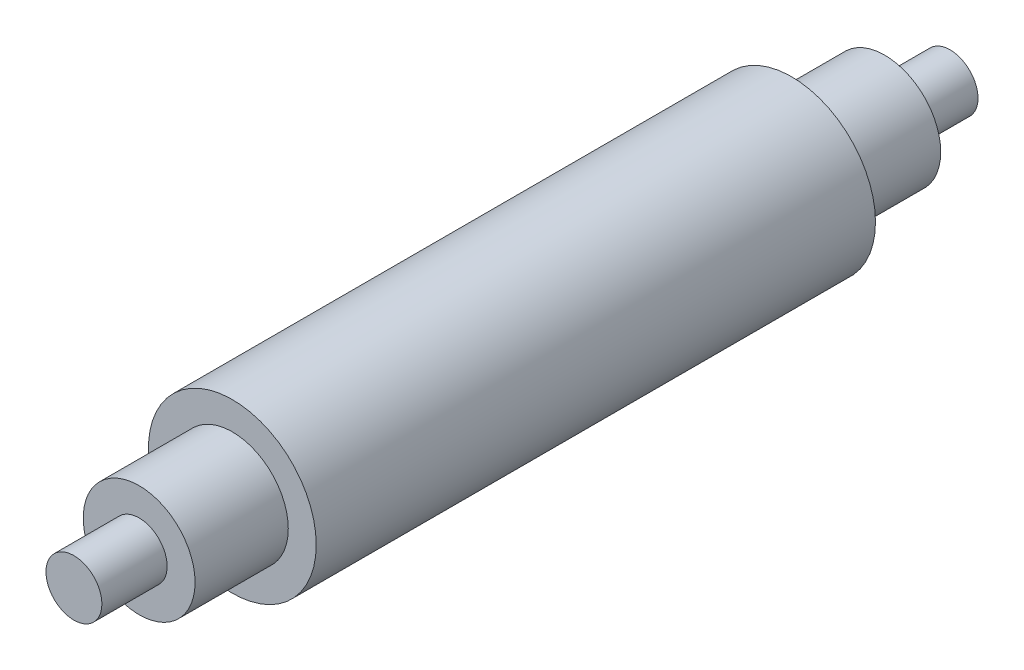
ISO-10303-21;
HEADER;
FILE_DESCRIPTION(('STEP AP214'),'2;1');
FILE_NAME('part.step','',(''),(''),'','','');
FILE_SCHEMA(('AUTOMOTIVE_DESIGN { 1 0 10303 214 1 1 1 1 }'));
ENDSEC;
DATA;
#1=APPLICATION_CONTEXT('core data for automotive mechanical design processes');
#2=APPLICATION_PROTOCOL_DEFINITION('international standard','automotive_design',2000,#1);
#3=PRODUCT_CONTEXT('',#1,'mechanical');
#4=PRODUCT('Part','Part','',(#3));
#5=PRODUCT_RELATED_PRODUCT_CATEGORY('part','',(#4));
#6=PRODUCT_DEFINITION_FORMATION('','',#4);
#7=PRODUCT_DEFINITION_CONTEXT('part definition',#1,'design');
#8=PRODUCT_DEFINITION('design','',#6,#7);
#9=PRODUCT_DEFINITION_SHAPE('','',#8);
#10=(LENGTH_UNIT() NAMED_UNIT(*) SI_UNIT(.MILLI.,.METRE.));
#11=(NAMED_UNIT(*) PLANE_ANGLE_UNIT() SI_UNIT($,.RADIAN.));
#12=(NAMED_UNIT(*) SI_UNIT($,.STERADIAN.) SOLID_ANGLE_UNIT());
#13=UNCERTAINTY_MEASURE_WITH_UNIT(LENGTH_MEASURE(1.E-05),#10,'distance_accuracy_value','');
#14=(GEOMETRIC_REPRESENTATION_CONTEXT(3) GLOBAL_UNCERTAINTY_ASSIGNED_CONTEXT((#13)) GLOBAL_UNIT_ASSIGNED_CONTEXT((#10,
#11,#12)) REPRESENTATION_CONTEXT('',''));
#15=CARTESIAN_POINT('',(0.,0.,0.));
#16=DIRECTION('',(0.,0.,1.));
#17=DIRECTION('',(1.,0.,0.));
#18=AXIS2_PLACEMENT_3D('',#15,#16,#17);
#19=CARTESIAN_POINT('',(0.,0.,-150.));
#20=DIRECTION('',(0.,0.,1.));
#21=DIRECTION('',(1.,0.,0.));
#22=AXIS2_PLACEMENT_3D('',#19,#20,#21);
#23=CYLINDRICAL_SURFACE('',#22,45.);
#24=CARTESIAN_POINT('',(0.,0.,-150.));
#25=DIRECTION('',(0.,0.,1.));
#26=DIRECTION('',(1.,0.,0.));
#27=AXIS2_PLACEMENT_3D('',#24,#25,#26);
#28=CIRCLE('',#27,45.);
#29=CARTESIAN_POINT('',(45.,0.,-150.));
#30=VERTEX_POINT('',#29);
#31=EDGE_CURVE('E55',#30,#30,#28,.T.);
#32=ORIENTED_EDGE('',*,*,#31,.T.);
#33=EDGE_LOOP('',(#32));
#34=FACE_BOUND('',#33,.T.);
#35=CARTESIAN_POINT('',(0.,0.,150.));
#36=DIRECTION('',(0.,0.,1.));
#37=DIRECTION('',(1.,0.,0.));
#38=AXIS2_PLACEMENT_3D('',#35,#36,#37);
#39=CIRCLE('',#38,45.);
#40=CARTESIAN_POINT('',(45.,0.,150.));
#41=VERTEX_POINT('',#40);
#42=EDGE_CURVE('E46',#41,#41,#39,.T.);
#43=ORIENTED_EDGE('',*,*,#42,.F.);
#44=EDGE_LOOP('',(#43));
#45=FACE_BOUND('',#44,.T.);
#46=ADVANCED_FACE('F43',(#34,#45),#23,.T.);
#47=CARTESIAN_POINT('',(0.,0.,-150.));
#48=DIRECTION('',(0.,0.,1.));
#49=DIRECTION('',(1.,0.,0.));
#50=AXIS2_PLACEMENT_3D('',#47,#48,#49);
#51=PLANE('',#50);
#52=CARTESIAN_POINT('',(0.,0.,-150.));
#53=DIRECTION('',(0.,0.,1.));
#54=DIRECTION('',(1.,0.,0.));
#55=AXIS2_PLACEMENT_3D('',#52,#53,#54);
#56=CIRCLE('',#55,30.);
#57=CARTESIAN_POINT('',(30.,0.,-150.));
#58=VERTEX_POINT('',#57);
#59=EDGE_CURVE('E121',#58,#58,#56,.T.);
#60=ORIENTED_EDGE('',*,*,#59,.T.);
#61=EDGE_LOOP('',(#60));
#62=FACE_BOUND('',#61,.T.);
#63=ORIENTED_EDGE('',*,*,#31,.F.);
#64=EDGE_LOOP('',(#63));
#65=FACE_BOUND('',#64,.T.);
#66=ADVANCED_FACE('F72',(#62,#65),#51,.F.);
#67=CARTESIAN_POINT('',(0.,0.,150.));
#68=DIRECTION('',(0.,0.,1.));
#69=DIRECTION('',(1.,0.,0.));
#70=AXIS2_PLACEMENT_3D('',#67,#68,#69);
#71=PLANE('',#70);
#72=CARTESIAN_POINT('',(0.,0.,150.));
#73=DIRECTION('',(0.,0.,1.));
#74=DIRECTION('',(1.,0.,0.));
#75=AXIS2_PLACEMENT_3D('',#72,#73,#74);
#76=CIRCLE('',#75,30.);
#77=CARTESIAN_POINT('',(30.,0.,150.));
#78=VERTEX_POINT('',#77);
#79=EDGE_CURVE('E50',#78,#78,#76,.T.);
#80=ORIENTED_EDGE('',*,*,#79,.F.);
#81=EDGE_LOOP('',(#80));
#82=FACE_BOUND('',#81,.T.);
#83=ORIENTED_EDGE('',*,*,#42,.T.);
#84=EDGE_LOOP('',(#83));
#85=FACE_BOUND('',#84,.T.);
#86=ADVANCED_FACE('F69',(#82,#85),#71,.T.);
#87=CARTESIAN_POINT('',(0.,0.,200.));
#88=DIRECTION('',(0.,0.,-1.));
#89=DIRECTION('',(-1.,0.,0.));
#90=AXIS2_PLACEMENT_3D('',#87,#88,#89);
#91=CYLINDRICAL_SURFACE('',#90,30.);
#92=CARTESIAN_POINT('',(0.,0.,200.));
#93=DIRECTION('',(0.,0.,1.));
#94=DIRECTION('',(1.,0.,0.));
#95=AXIS2_PLACEMENT_3D('',#92,#93,#94);
#96=CIRCLE('',#95,30.);
#97=CARTESIAN_POINT('',(30.,0.,200.));
#98=VERTEX_POINT('',#97);
#99=EDGE_CURVE('E61',#98,#98,#96,.T.);
#100=ORIENTED_EDGE('',*,*,#99,.F.);
#101=EDGE_LOOP('',(#100));
#102=FACE_BOUND('',#101,.T.);
#103=ORIENTED_EDGE('',*,*,#79,.T.);
#104=EDGE_LOOP('',(#103));
#105=FACE_BOUND('',#104,.T.);
#106=ADVANCED_FACE('F83',(#102,#105),#91,.T.);
#107=CARTESIAN_POINT('',(0.,0.,200.));
#108=DIRECTION('',(0.,0.,1.));
#109=DIRECTION('',(1.,0.,0.));
#110=AXIS2_PLACEMENT_3D('',#107,#108,#109);
#111=PLANE('',#110);
#112=CARTESIAN_POINT('',(0.,0.,200.));
#113=DIRECTION('',(0.,0.,1.));
#114=DIRECTION('',(1.,0.,0.));
#115=AXIS2_PLACEMENT_3D('',#112,#113,#114);
#116=CIRCLE('',#115,15.);
#117=CARTESIAN_POINT('',(15.,0.,200.));
#118=VERTEX_POINT('',#117);
#119=EDGE_CURVE('E10',#118,#118,#116,.T.);
#120=ORIENTED_EDGE('',*,*,#119,.F.);
#121=EDGE_LOOP('',(#120));
#122=FACE_BOUND('',#121,.T.);
#123=ORIENTED_EDGE('',*,*,#99,.T.);
#124=EDGE_LOOP('',(#123));
#125=FACE_BOUND('',#124,.T.);
#126=ADVANCED_FACE('F90',(#122,#125),#111,.T.);
#127=CARTESIAN_POINT('',(0.,0.,235.));
#128=DIRECTION('',(0.,0.,-1.));
#129=DIRECTION('',(-1.,0.,0.));
#130=AXIS2_PLACEMENT_3D('',#127,#128,#129);
#131=CYLINDRICAL_SURFACE('',#130,15.);
#132=CARTESIAN_POINT('',(0.,0.,235.));
#133=DIRECTION('',(0.,0.,1.));
#134=DIRECTION('',(1.,0.,0.));
#135=AXIS2_PLACEMENT_3D('',#132,#133,#134);
#136=CIRCLE('',#135,15.);
#137=CARTESIAN_POINT('',(15.,0.,235.));
#138=VERTEX_POINT('',#137);
#139=EDGE_CURVE('E59',#138,#138,#136,.T.);
#140=ORIENTED_EDGE('',*,*,#139,.F.);
#141=EDGE_LOOP('',(#140));
#142=FACE_BOUND('',#141,.T.);
#143=ORIENTED_EDGE('',*,*,#119,.T.);
#144=EDGE_LOOP('',(#143));
#145=FACE_BOUND('',#144,.T.);
#146=ADVANCED_FACE('F94',(#142,#145),#131,.T.);
#147=CARTESIAN_POINT('',(0.,0.,235.));
#148=DIRECTION('',(0.,0.,1.));
#149=DIRECTION('',(1.,0.,0.));
#150=AXIS2_PLACEMENT_3D('',#147,#148,#149);
#151=PLANE('',#150);
#152=ORIENTED_EDGE('',*,*,#139,.T.);
#153=EDGE_LOOP('',(#152));
#154=FACE_BOUND('',#153,.T.);
#155=ADVANCED_FACE('F98',(#154),#151,.T.);
#156=CARTESIAN_POINT('',(0.,0.,-200.));
#157=DIRECTION('',(0.,0.,1.));
#158=DIRECTION('',(1.,0.,0.));
#159=AXIS2_PLACEMENT_3D('',#156,#157,#158);
#160=CYLINDRICAL_SURFACE('',#159,30.);
#161=CARTESIAN_POINT('',(0.,0.,-200.));
#162=DIRECTION('',(0.,0.,1.));
#163=DIRECTION('',(1.,0.,0.));
#164=AXIS2_PLACEMENT_3D('',#161,#162,#163);
#165=CIRCLE('',#164,30.);
#166=CARTESIAN_POINT('',(30.,0.,-200.));
#167=VERTEX_POINT('',#166);
#168=EDGE_CURVE('E124',#167,#167,#165,.T.);
#169=ORIENTED_EDGE('',*,*,#168,.T.);
#170=EDGE_LOOP('',(#169));
#171=FACE_BOUND('',#170,.T.);
#172=ORIENTED_EDGE('',*,*,#59,.F.);
#173=EDGE_LOOP('',(#172));
#174=FACE_BOUND('',#173,.T.);
#175=ADVANCED_FACE('F101',(#171,#174),#160,.T.);
#176=CARTESIAN_POINT('',(0.,0.,-200.));
#177=DIRECTION('',(0.,0.,-1.));
#178=DIRECTION('',(1.,0.,0.));
#179=AXIS2_PLACEMENT_3D('',#176,#177,#178);
#180=PLANE('',#179);
#181=CARTESIAN_POINT('',(0.,0.,-200.));
#182=DIRECTION('',(0.,0.,1.));
#183=DIRECTION('',(1.,0.,0.));
#184=AXIS2_PLACEMENT_3D('',#181,#182,#183);
#185=CIRCLE('',#184,15.);
#186=CARTESIAN_POINT('',(15.,0.,-200.));
#187=VERTEX_POINT('',#186);
#188=EDGE_CURVE('E122',#187,#187,#185,.T.);
#189=ORIENTED_EDGE('',*,*,#188,.T.);
#190=EDGE_LOOP('',(#189));
#191=FACE_BOUND('',#190,.T.);
#192=ORIENTED_EDGE('',*,*,#168,.F.);
#193=EDGE_LOOP('',(#192));
#194=FACE_BOUND('',#193,.T.);
#195=ADVANCED_FACE('F104',(#191,#194),#180,.T.);
#196=CARTESIAN_POINT('',(0.,0.,-235.));
#197=DIRECTION('',(0.,0.,1.));
#198=DIRECTION('',(1.,0.,0.));
#199=AXIS2_PLACEMENT_3D('',#196,#197,#198);
#200=CYLINDRICAL_SURFACE('',#199,15.);
#201=CARTESIAN_POINT('',(0.,0.,-235.));
#202=DIRECTION('',(0.,0.,1.));
#203=DIRECTION('',(1.,0.,0.));
#204=AXIS2_PLACEMENT_3D('',#201,#202,#203);
#205=CIRCLE('',#204,15.);
#206=CARTESIAN_POINT('',(15.,0.,-235.));
#207=VERTEX_POINT('',#206);
#208=EDGE_CURVE('E120',#207,#207,#205,.T.);
#209=ORIENTED_EDGE('',*,*,#208,.T.);
#210=EDGE_LOOP('',(#209));
#211=FACE_BOUND('',#210,.T.);
#212=ORIENTED_EDGE('',*,*,#188,.F.);
#213=EDGE_LOOP('',(#212));
#214=FACE_BOUND('',#213,.T.);
#215=ADVANCED_FACE('F108',(#211,#214),#200,.T.);
#216=CARTESIAN_POINT('',(0.,0.,-235.));
#217=DIRECTION('',(0.,0.,-1.));
#218=DIRECTION('',(1.,0.,0.));
#219=AXIS2_PLACEMENT_3D('',#216,#217,#218);
#220=PLANE('',#219);
#221=ORIENTED_EDGE('',*,*,#208,.F.);
#222=EDGE_LOOP('',(#221));
#223=FACE_BOUND('',#222,.T.);
#224=ADVANCED_FACE('F112',(#223),#220,.T.);
#225=CLOSED_SHELL('',(#46,#66,#86,#106,#126,#146,#155,#175,#195,#215,#224));
#226=MANIFOLD_SOLID_BREP('B2',#225);
#227=ADVANCED_BREP_SHAPE_REPRESENTATION('',(#18,#226),#14);
#228=SHAPE_DEFINITION_REPRESENTATION(#9,#227);
ENDSEC;
END-ISO-10303-21;
